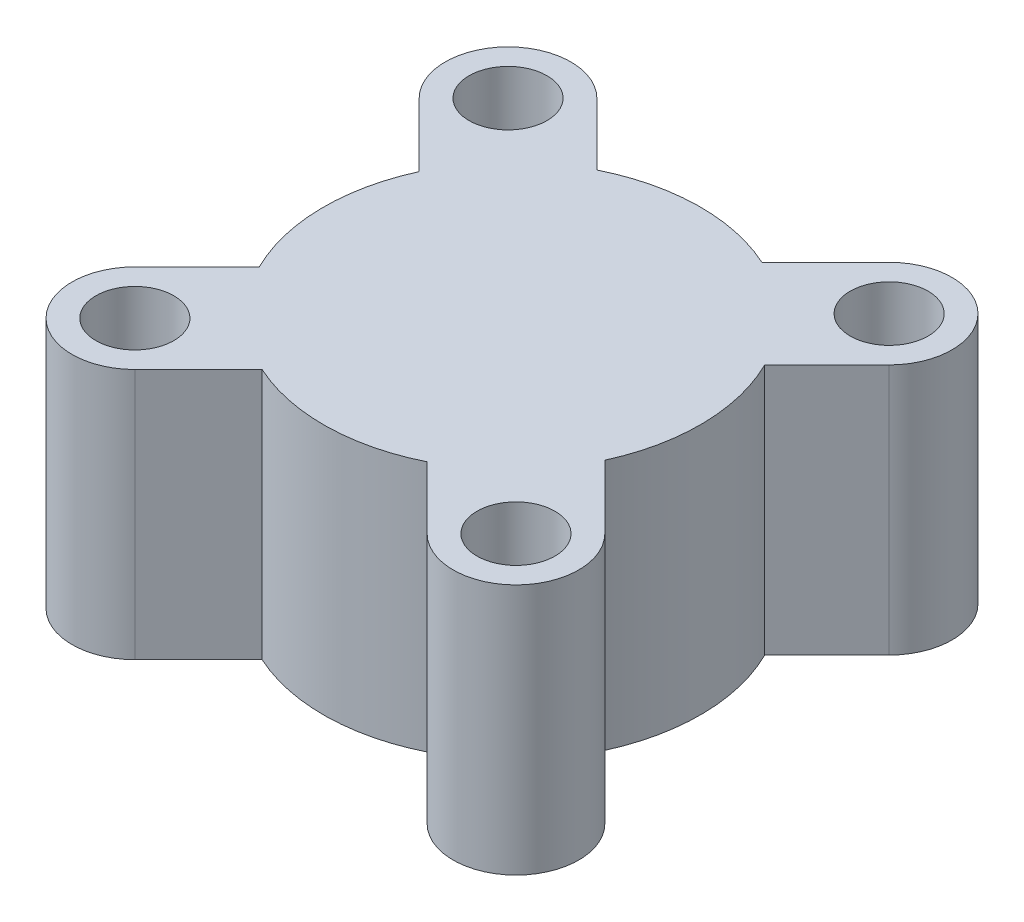
ISO-10303-21;
HEADER;
FILE_DESCRIPTION(('STEP AP214'),'2;1');
FILE_NAME('part.step','',(''),(''),'','','');
FILE_SCHEMA(('AUTOMOTIVE_DESIGN { 1 0 10303 214 1 1 1 1 }'));
ENDSEC;
DATA;
#1=APPLICATION_CONTEXT('core data for automotive mechanical design processes');
#2=APPLICATION_PROTOCOL_DEFINITION('international standard','automotive_design',2000,#1);
#3=PRODUCT_CONTEXT('',#1,'mechanical');
#4=PRODUCT('Part','Part','',(#3));
#5=PRODUCT_RELATED_PRODUCT_CATEGORY('part','',(#4));
#6=PRODUCT_DEFINITION_FORMATION('','',#4);
#7=PRODUCT_DEFINITION_CONTEXT('part definition',#1,'design');
#8=PRODUCT_DEFINITION('design','',#6,#7);
#9=PRODUCT_DEFINITION_SHAPE('','',#8);
#10=(LENGTH_UNIT() NAMED_UNIT(*) SI_UNIT(.MILLI.,.METRE.));
#11=(NAMED_UNIT(*) PLANE_ANGLE_UNIT() SI_UNIT($,.RADIAN.));
#12=(NAMED_UNIT(*) SI_UNIT($,.STERADIAN.) SOLID_ANGLE_UNIT());
#13=UNCERTAINTY_MEASURE_WITH_UNIT(LENGTH_MEASURE(1.E-05),#10,'distance_accuracy_value','');
#14=(GEOMETRIC_REPRESENTATION_CONTEXT(3) GLOBAL_UNCERTAINTY_ASSIGNED_CONTEXT((#13)) GLOBAL_UNIT_ASSIGNED_CONTEXT((#10,
#11,#12)) REPRESENTATION_CONTEXT('',''));
#15=CARTESIAN_POINT('',(0.,0.,0.));
#16=DIRECTION('',(0.,0.,1.));
#17=DIRECTION('',(1.,0.,0.));
#18=AXIS2_PLACEMENT_3D('',#15,#16,#17);
#19=CARTESIAN_POINT('',(0.,10.,0.));
#20=DIRECTION('',(0.,-1.,0.));
#21=DIRECTION('',(0.,0.,-1.));
#22=AXIS2_PLACEMENT_3D('',#19,#20,#21);
#23=CYLINDRICAL_SURFACE('',#22,7.5);
#24=CARTESIAN_POINT('',(0.,10.,0.));
#25=DIRECTION('',(0.,1.,0.));
#26=DIRECTION('',(0.,0.,1.));
#27=AXIS2_PLACEMENT_3D('',#24,#25,#26);
#28=CIRCLE('',#27,7.5);
#29=CARTESIAN_POINT('',(-6.81877033646609,10.,-3.12319885670608));
#30=VERTEX_POINT('',#29);
#31=CARTESIAN_POINT('',(-6.71533963777482,10.,3.33979244105533));
#32=VERTEX_POINT('',#31);
#33=EDGE_CURVE('E46',#30,#32,#28,.T.);
#34=ORIENTED_EDGE('',*,*,#33,.F.);
#35=DIRECTION('',(0.,-1.,0.));
#36=VECTOR('',#35,1.);
#37=CARTESIAN_POINT('',(-6.81877033646609,10.,-3.12319885670608));
#38=LINE('',#37,#36);
#39=CARTESIAN_POINT('',(-6.81877033646609,0.,-3.12319885670608));
#40=VERTEX_POINT('',#39);
#41=EDGE_CURVE('E190',#30,#40,#38,.T.);
#42=ORIENTED_EDGE('',*,*,#41,.T.);
#43=CARTESIAN_POINT('',(0.,0.,0.));
#44=DIRECTION('',(0.,1.,0.));
#45=DIRECTION('',(0.,0.,1.));
#46=AXIS2_PLACEMENT_3D('',#43,#44,#45);
#47=CIRCLE('',#46,7.5);
#48=CARTESIAN_POINT('',(-6.71533963777482,0.,3.33979244105533));
#49=VERTEX_POINT('',#48);
#50=EDGE_CURVE('E287',#40,#49,#47,.T.);
#51=ORIENTED_EDGE('',*,*,#50,.T.);
#52=DIRECTION('',(0.,-1.,0.));
#53=VECTOR('',#52,1.);
#54=CARTESIAN_POINT('',(-6.71533963777482,10.,3.33979244105533));
#55=LINE('',#54,#53);
#56=EDGE_CURVE('E291',#32,#49,#55,.T.);
#57=ORIENTED_EDGE('',*,*,#56,.F.);
#58=EDGE_LOOP('',(#34,#42,#51,#57));
#59=FACE_BOUND('',#58,.T.);
#60=ADVANCED_FACE('F36',(#59),#23,.T.);
#61=CARTESIAN_POINT('',(3.1231988567061,0.,-6.81877033646608));
#62=VERTEX_POINT('',#61);
#63=CARTESIAN_POINT('',(-3.3397924410554,0.,-6.71533963777479));
#64=VERTEX_POINT('',#63);
#65=EDGE_CURVE('E311',#62,#64,#47,.T.);
#66=ORIENTED_EDGE('',*,*,#65,.T.);
#67=DIRECTION('',(0.,-1.,0.));
#68=VECTOR('',#67,1.);
#69=CARTESIAN_POINT('',(-3.3397924410554,10.,-6.71533963777479));
#70=LINE('',#69,#68);
#71=CARTESIAN_POINT('',(-3.3397924410554,10.,-6.71533963777479));
#72=VERTEX_POINT('',#71);
#73=EDGE_CURVE('E60',#72,#64,#70,.T.);
#74=ORIENTED_EDGE('',*,*,#73,.F.);
#75=CARTESIAN_POINT('',(3.1231988567061,10.,-6.81877033646608));
#76=VERTEX_POINT('',#75);
#77=EDGE_CURVE('E171',#76,#72,#28,.T.);
#78=ORIENTED_EDGE('',*,*,#77,.F.);
#79=DIRECTION('',(0.,-1.,0.));
#80=VECTOR('',#79,1.);
#81=CARTESIAN_POINT('',(3.1231988567061,10.,-6.81877033646608));
#82=LINE('',#81,#80);
#83=EDGE_CURVE('E220',#76,#62,#82,.T.);
#84=ORIENTED_EDGE('',*,*,#83,.T.);
#85=EDGE_LOOP('',(#66,#74,#78,#84));
#86=FACE_BOUND('',#85,.T.);
#87=ADVANCED_FACE('F345',(#86),#23,.T.);
#88=CARTESIAN_POINT('',(6.81877033646607,0.,3.12319885670613));
#89=VERTEX_POINT('',#88);
#90=CARTESIAN_POINT('',(6.7153396377748,0.,-3.33979244105537));
#91=VERTEX_POINT('',#90);
#92=EDGE_CURVE('E312',#89,#91,#47,.T.);
#93=ORIENTED_EDGE('',*,*,#92,.T.);
#94=DIRECTION('',(0.,-1.,0.));
#95=VECTOR('',#94,1.);
#96=CARTESIAN_POINT('',(6.7153396377748,10.,-3.33979244105537));
#97=LINE('',#96,#95);
#98=CARTESIAN_POINT('',(6.7153396377748,10.,-3.33979244105537));
#99=VERTEX_POINT('',#98);
#100=EDGE_CURVE('E223',#99,#91,#97,.T.);
#101=ORIENTED_EDGE('',*,*,#100,.F.);
#102=CARTESIAN_POINT('',(6.81877033646607,10.,3.12319885670613));
#103=VERTEX_POINT('',#102);
#104=EDGE_CURVE('E45',#103,#99,#28,.T.);
#105=ORIENTED_EDGE('',*,*,#104,.F.);
#106=DIRECTION('',(0.,-1.,0.));
#107=VECTOR('',#106,1.);
#108=CARTESIAN_POINT('',(6.81877033646607,10.,3.12319885670613));
#109=LINE('',#108,#107);
#110=EDGE_CURVE('E254',#103,#89,#109,.T.);
#111=ORIENTED_EDGE('',*,*,#110,.T.);
#112=EDGE_LOOP('',(#93,#101,#105,#111));
#113=FACE_BOUND('',#112,.T.);
#114=ADVANCED_FACE('F315',(#113),#23,.T.);
#115=CARTESIAN_POINT('',(-3.12319885670615,0.,6.81877033646605));
#116=VERTEX_POINT('',#115);
#117=CARTESIAN_POINT('',(3.33979244105535,0.,6.71533963777481));
#118=VERTEX_POINT('',#117);
#119=EDGE_CURVE('E40',#116,#118,#47,.T.);
#120=ORIENTED_EDGE('',*,*,#119,.T.);
#121=DIRECTION('',(0.,-1.,0.));
#122=VECTOR('',#121,1.);
#123=CARTESIAN_POINT('',(3.33979244105535,10.,6.71533963777481));
#124=LINE('',#123,#122);
#125=CARTESIAN_POINT('',(3.33979244105535,10.,6.71533963777481));
#126=VERTEX_POINT('',#125);
#127=EDGE_CURVE('E257',#126,#118,#124,.T.);
#128=ORIENTED_EDGE('',*,*,#127,.F.);
#129=CARTESIAN_POINT('',(-3.12319885670615,10.,6.81877033646605));
#130=VERTEX_POINT('',#129);
#131=EDGE_CURVE('E11',#130,#126,#28,.T.);
#132=ORIENTED_EDGE('',*,*,#131,.F.);
#133=DIRECTION('',(0.,-1.,0.));
#134=VECTOR('',#133,1.);
#135=CARTESIAN_POINT('',(-3.12319885670615,10.,6.81877033646605));
#136=LINE('',#135,#134);
#137=EDGE_CURVE('E288',#130,#116,#136,.T.);
#138=ORIENTED_EDGE('',*,*,#137,.T.);
#139=EDGE_LOOP('',(#120,#128,#132,#138));
#140=FACE_BOUND('',#139,.T.);
#141=ADVANCED_FACE('F38',(#140),#23,.T.);
#142=CARTESIAN_POINT('',(0.,10.,0.));
#143=DIRECTION('',(0.,1.,0.));
#144=DIRECTION('',(0.,0.,1.));
#145=AXIS2_PLACEMENT_3D('',#142,#143,#144);
#146=PLANE('',#145);
#147=ORIENTED_EDGE('',*,*,#131,.T.);
#148=DIRECTION('',(-0.706793222581446,0.,-0.707420200809204));
#149=VECTOR('',#148,1.);
#150=CARTESIAN_POINT('',(5.81370838683992,10.,9.19145013125135));
#151=LINE('',#150,#149);
#152=CARTESIAN_POINT('',(5.81370838683992,10.,9.19145013125135));
#153=VERTEX_POINT('',#152);
#154=EDGE_CURVE('E236',#153,#126,#151,.T.);
#155=ORIENTED_EDGE('',*,*,#154,.F.);
#156=CARTESIAN_POINT('',(7.58225888886293,10.,7.42446707479773));
#157=DIRECTION('',(0.,-1.,0.));
#158=DIRECTION('',(0.,0.,-1.));
#159=AXIS2_PLACEMENT_3D('',#156,#157,#158);
#160=CIRCLE('',#159,2.5);
#161=CARTESIAN_POINT('',(9.35080939088594,10.,5.65748401834412));
#162=VERTEX_POINT('',#161);
#163=EDGE_CURVE('E233',#162,#153,#160,.T.);
#164=ORIENTED_EDGE('',*,*,#163,.F.);
#165=DIRECTION('',(0.706793222581445,0.,0.707420200809205));
#166=VECTOR('',#165,1.);
#167=CARTESIAN_POINT('',(9.35080939088594,10.,5.65748401834412));
#168=LINE('',#167,#166);
#169=EDGE_CURVE('E240',#103,#162,#168,.T.);
#170=ORIENTED_EDGE('',*,*,#169,.F.);
#171=ORIENTED_EDGE('',*,*,#104,.T.);
#172=DIRECTION('',(-0.707420200809202,0.,0.706793222581448));
#173=VECTOR('',#172,1.);
#174=CARTESIAN_POINT('',(9.19145013125132,10.,-5.81370838683995));
#175=LINE('',#174,#173);
#176=CARTESIAN_POINT('',(9.19145013125132,10.,-5.81370838683995));
#177=VERTEX_POINT('',#176);
#178=EDGE_CURVE('E202',#177,#99,#175,.T.);
#179=ORIENTED_EDGE('',*,*,#178,.F.);
#180=CARTESIAN_POINT('',(7.4244670747977,10.,-7.58225888886295));
#181=DIRECTION('',(0.,-1.,0.));
#182=DIRECTION('',(0.,0.,-1.));
#183=AXIS2_PLACEMENT_3D('',#180,#181,#182);
#184=CIRCLE('',#183,2.5);
#185=CARTESIAN_POINT('',(5.65748401834408,10.,-9.35080939088596));
#186=VERTEX_POINT('',#185);
#187=EDGE_CURVE('E199',#186,#177,#184,.T.);
#188=ORIENTED_EDGE('',*,*,#187,.F.);
#189=DIRECTION('',(0.707420200809202,0.,-0.706793222581448));
#190=VECTOR('',#189,1.);
#191=CARTESIAN_POINT('',(5.65748401834408,10.,-9.35080939088596));
#192=LINE('',#191,#190);
#193=EDGE_CURVE('E206',#76,#186,#192,.T.);
#194=ORIENTED_EDGE('',*,*,#193,.F.);
#195=ORIENTED_EDGE('',*,*,#77,.T.);
#196=DIRECTION('',(0.70679322258145,0.,0.707420200809199));
#197=VECTOR('',#196,1.);
#198=CARTESIAN_POINT('',(-5.81370838683998,10.,-9.1914501312513));
#199=LINE('',#198,#197);
#200=CARTESIAN_POINT('',(-5.81370838683998,10.,-9.1914501312513));
#201=VERTEX_POINT('',#200);
#202=EDGE_CURVE('E154',#201,#72,#199,.T.);
#203=ORIENTED_EDGE('',*,*,#202,.F.);
#204=CARTESIAN_POINT('',(-7.58225888886298,10.,-7.42446707479768));
#205=DIRECTION('',(0.,-1.,0.));
#206=DIRECTION('',(0.,0.,-1.));
#207=AXIS2_PLACEMENT_3D('',#204,#205,#206);
#208=CIRCLE('',#207,2.5);
#209=CARTESIAN_POINT('',(-9.35080939088598,10.,-5.65748401834405));
#210=VERTEX_POINT('',#209);
#211=EDGE_CURVE('E168',#210,#201,#208,.T.);
#212=ORIENTED_EDGE('',*,*,#211,.F.);
#213=DIRECTION('',(-0.70679322258145,0.,-0.7074202008092));
#214=VECTOR('',#213,1.);
#215=CARTESIAN_POINT('',(-9.35080939088598,10.,-5.65748401834405));
#216=LINE('',#215,#214);
#217=EDGE_CURVE('E161',#30,#210,#216,.T.);
#218=ORIENTED_EDGE('',*,*,#217,.F.);
#219=ORIENTED_EDGE('',*,*,#33,.T.);
#220=DIRECTION('',(0.707420200809207,0.,-0.706793222581443));
#221=VECTOR('',#220,1.);
#222=CARTESIAN_POINT('',(-9.19145013125137,10.,5.81370838683988));
#223=LINE('',#222,#221);
#224=CARTESIAN_POINT('',(-9.19145013125137,10.,5.81370838683988));
#225=VERTEX_POINT('',#224);
#226=EDGE_CURVE('E270',#225,#32,#223,.T.);
#227=ORIENTED_EDGE('',*,*,#226,.F.);
#228=CARTESIAN_POINT('',(-7.42446707479776,10.,7.5822588888629));
#229=DIRECTION('',(0.,-1.,0.));
#230=DIRECTION('',(0.,0.,-1.));
#231=AXIS2_PLACEMENT_3D('',#228,#229,#230);
#232=CIRCLE('',#231,2.5);
#233=CARTESIAN_POINT('',(-5.65748401834415,10.,9.35080939088592));
#234=VERTEX_POINT('',#233);
#235=EDGE_CURVE('E267',#234,#225,#232,.T.);
#236=ORIENTED_EDGE('',*,*,#235,.F.);
#237=DIRECTION('',(-0.707420200809207,0.,0.706793222581443));
#238=VECTOR('',#237,1.);
#239=CARTESIAN_POINT('',(-5.65748401834415,10.,9.35080939088592));
#240=LINE('',#239,#238);
#241=EDGE_CURVE('E274',#130,#234,#240,.T.);
#242=ORIENTED_EDGE('',*,*,#241,.F.);
#243=EDGE_LOOP('',(#147,#155,#164,#170,#171,#179,#188,#194,#195,#203,#212,#218,#219,#227,#236,#242));
#244=FACE_BOUND('',#243,.T.);
#245=CARTESIAN_POINT('',(-7.42446707479776,10.,7.5822588888629));
#246=DIRECTION('',(0.,-1.,0.));
#247=DIRECTION('',(0.,0.,-1.));
#248=AXIS2_PLACEMENT_3D('',#245,#246,#247);
#249=CIRCLE('',#248,1.55);
#250=CARTESIAN_POINT('',(-7.42446707479776,10.,6.0322588888629));
#251=VERTEX_POINT('',#250);
#252=EDGE_CURVE('E261',#251,#251,#249,.T.);
#253=ORIENTED_EDGE('',*,*,#252,.T.);
#254=EDGE_LOOP('',(#253));
#255=FACE_BOUND('',#254,.T.);
#256=CARTESIAN_POINT('',(7.58225888886293,10.,7.42446707479773));
#257=DIRECTION('',(0.,-1.,0.));
#258=DIRECTION('',(0.,0.,-1.));
#259=AXIS2_PLACEMENT_3D('',#256,#257,#258);
#260=CIRCLE('',#259,1.55);
#261=CARTESIAN_POINT('',(7.58225888886293,10.,5.87446707479773));
#262=VERTEX_POINT('',#261);
#263=EDGE_CURVE('E227',#262,#262,#260,.T.);
#264=ORIENTED_EDGE('',*,*,#263,.T.);
#265=EDGE_LOOP('',(#264));
#266=FACE_BOUND('',#265,.T.);
#267=CARTESIAN_POINT('',(7.4244670747977,10.,-7.58225888886295));
#268=DIRECTION('',(0.,-1.,0.));
#269=DIRECTION('',(0.,0.,-1.));
#270=AXIS2_PLACEMENT_3D('',#267,#268,#269);
#271=CIRCLE('',#270,1.55);
#272=CARTESIAN_POINT('',(7.4244670747977,10.,-9.13225888886296));
#273=VERTEX_POINT('',#272);
#274=EDGE_CURVE('E193',#273,#273,#271,.T.);
#275=ORIENTED_EDGE('',*,*,#274,.T.);
#276=EDGE_LOOP('',(#275));
#277=FACE_BOUND('',#276,.T.);
#278=CARTESIAN_POINT('',(-7.58225888886298,10.,-7.42446707479768));
#279=DIRECTION('',(0.,-1.,0.));
#280=DIRECTION('',(0.,0.,-1.));
#281=AXIS2_PLACEMENT_3D('',#278,#279,#280);
#282=CIRCLE('',#281,1.55);
#283=CARTESIAN_POINT('',(-7.58225888886298,10.,-8.97446707479768));
#284=VERTEX_POINT('',#283);
#285=EDGE_CURVE('E186',#284,#284,#282,.T.);
#286=ORIENTED_EDGE('',*,*,#285,.T.);
#287=EDGE_LOOP('',(#286));
#288=FACE_BOUND('',#287,.T.);
#289=ADVANCED_FACE('F165',(#244,#255,#266,#277,#288),#146,.T.);
#290=CARTESIAN_POINT('',(0.,0.,0.));
#291=DIRECTION('',(0.,1.,0.));
#292=DIRECTION('',(0.,0.,1.));
#293=AXIS2_PLACEMENT_3D('',#290,#291,#292);
#294=PLANE('',#293);
#295=CARTESIAN_POINT('',(0.,0.,0.));
#296=DIRECTION('',(0.,-1.,0.));
#297=DIRECTION('',(0.,0.,-1.));
#298=AXIS2_PLACEMENT_3D('',#295,#296,#297);
#299=CIRCLE('',#298,6.05);
#300=CARTESIAN_POINT('',(0.,0.,-6.05));
#301=VERTEX_POINT('',#300);
#302=EDGE_CURVE('E404',#301,#301,#299,.T.);
#303=ORIENTED_EDGE('',*,*,#302,.F.);
#304=EDGE_LOOP('',(#303));
#305=FACE_BOUND('',#304,.T.);
#306=ORIENTED_EDGE('',*,*,#119,.F.);
#307=DIRECTION('',(-0.707420200809207,0.,0.706793222581443));
#308=VECTOR('',#307,1.);
#309=CARTESIAN_POINT('',(-5.65748401834415,0.,9.35080939088592));
#310=LINE('',#309,#308);
#311=CARTESIAN_POINT('',(-5.65748401834415,0.,9.35080939088592));
#312=VERTEX_POINT('',#311);
#313=EDGE_CURVE('E271',#116,#312,#310,.T.);
#314=ORIENTED_EDGE('',*,*,#313,.T.);
#315=CARTESIAN_POINT('',(-7.42446707479776,0.,7.5822588888629));
#316=DIRECTION('',(0.,-1.,0.));
#317=DIRECTION('',(0.,0.,-1.));
#318=AXIS2_PLACEMENT_3D('',#315,#316,#317);
#319=CIRCLE('',#318,2.5);
#320=CARTESIAN_POINT('',(-9.19145013125137,0.,5.81370838683988));
#321=VERTEX_POINT('',#320);
#322=EDGE_CURVE('E264',#312,#321,#319,.T.);
#323=ORIENTED_EDGE('',*,*,#322,.T.);
#324=DIRECTION('',(0.707420200809207,0.,-0.706793222581443));
#325=VECTOR('',#324,1.);
#326=CARTESIAN_POINT('',(-9.19145013125137,0.,5.81370838683988));
#327=LINE('',#326,#325);
#328=EDGE_CURVE('E280',#321,#49,#327,.T.);
#329=ORIENTED_EDGE('',*,*,#328,.T.);
#330=ORIENTED_EDGE('',*,*,#50,.F.);
#331=DIRECTION('',(-0.70679322258145,0.,-0.7074202008092));
#332=VECTOR('',#331,1.);
#333=CARTESIAN_POINT('',(-9.35080939088598,0.,-5.65748401834405));
#334=LINE('',#333,#332);
#335=CARTESIAN_POINT('',(-9.35080939088598,0.,-5.65748401834405));
#336=VERTEX_POINT('',#335);
#337=EDGE_CURVE('E175',#40,#336,#334,.T.);
#338=ORIENTED_EDGE('',*,*,#337,.T.);
#339=CARTESIAN_POINT('',(-7.58225888886298,0.,-7.42446707479768));
#340=DIRECTION('',(0.,-1.,0.));
#341=DIRECTION('',(0.,0.,-1.));
#342=AXIS2_PLACEMENT_3D('',#339,#340,#341);
#343=CIRCLE('',#342,2.5);
#344=CARTESIAN_POINT('',(-5.81370838683998,0.,-9.1914501312513));
#345=VERTEX_POINT('',#344);
#346=EDGE_CURVE('E184',#336,#345,#343,.T.);
#347=ORIENTED_EDGE('',*,*,#346,.T.);
#348=DIRECTION('',(0.70679322258145,0.,0.707420200809199));
#349=VECTOR('',#348,1.);
#350=CARTESIAN_POINT('',(-5.81370838683998,0.,-9.1914501312513));
#351=LINE('',#350,#349);
#352=EDGE_CURVE('E156',#345,#64,#351,.T.);
#353=ORIENTED_EDGE('',*,*,#352,.T.);
#354=ORIENTED_EDGE('',*,*,#65,.F.);
#355=DIRECTION('',(0.707420200809202,0.,-0.706793222581448));
#356=VECTOR('',#355,1.);
#357=CARTESIAN_POINT('',(5.65748401834408,0.,-9.35080939088596));
#358=LINE('',#357,#356);
#359=CARTESIAN_POINT('',(5.65748401834408,0.,-9.35080939088596));
#360=VERTEX_POINT('',#359);
#361=EDGE_CURVE('E203',#62,#360,#358,.T.);
#362=ORIENTED_EDGE('',*,*,#361,.T.);
#363=CARTESIAN_POINT('',(7.4244670747977,0.,-7.58225888886295));
#364=DIRECTION('',(0.,-1.,0.));
#365=DIRECTION('',(0.,0.,-1.));
#366=AXIS2_PLACEMENT_3D('',#363,#364,#365);
#367=CIRCLE('',#366,2.5);
#368=CARTESIAN_POINT('',(9.19145013125132,0.,-5.81370838683995));
#369=VERTEX_POINT('',#368);
#370=EDGE_CURVE('E196',#360,#369,#367,.T.);
#371=ORIENTED_EDGE('',*,*,#370,.T.);
#372=DIRECTION('',(-0.707420200809202,0.,0.706793222581448));
#373=VECTOR('',#372,1.);
#374=CARTESIAN_POINT('',(9.19145013125132,0.,-5.81370838683995));
#375=LINE('',#374,#373);
#376=EDGE_CURVE('E212',#369,#91,#375,.T.);
#377=ORIENTED_EDGE('',*,*,#376,.T.);
#378=ORIENTED_EDGE('',*,*,#92,.F.);
#379=DIRECTION('',(0.706793222581445,0.,0.707420200809205));
#380=VECTOR('',#379,1.);
#381=CARTESIAN_POINT('',(9.35080939088594,0.,5.65748401834412));
#382=LINE('',#381,#380);
#383=CARTESIAN_POINT('',(9.35080939088594,0.,5.65748401834412));
#384=VERTEX_POINT('',#383);
#385=EDGE_CURVE('E237',#89,#384,#382,.T.);
#386=ORIENTED_EDGE('',*,*,#385,.T.);
#387=CARTESIAN_POINT('',(7.58225888886293,0.,7.42446707479773));
#388=DIRECTION('',(0.,-1.,0.));
#389=DIRECTION('',(0.,0.,-1.));
#390=AXIS2_PLACEMENT_3D('',#387,#388,#389);
#391=CIRCLE('',#390,2.5);
#392=CARTESIAN_POINT('',(5.81370838683992,0.,9.19145013125135));
#393=VERTEX_POINT('',#392);
#394=EDGE_CURVE('E230',#384,#393,#391,.T.);
#395=ORIENTED_EDGE('',*,*,#394,.T.);
#396=DIRECTION('',(-0.706793222581446,0.,-0.707420200809204));
#397=VECTOR('',#396,1.);
#398=CARTESIAN_POINT('',(5.81370838683992,0.,9.19145013125135));
#399=LINE('',#398,#397);
#400=EDGE_CURVE('E246',#393,#118,#399,.T.);
#401=ORIENTED_EDGE('',*,*,#400,.T.);
#402=EDGE_LOOP('',(#306,#314,#323,#329,#330,#338,#347,#353,#354,#362,#371,#377,#378,#386,#395,#401));
#403=FACE_BOUND('',#402,.T.);
#404=CARTESIAN_POINT('',(-7.42446707479776,0.,7.5822588888629));
#405=DIRECTION('',(0.,-1.,0.));
#406=DIRECTION('',(0.,0.,-1.));
#407=AXIS2_PLACEMENT_3D('',#404,#405,#406);
#408=CIRCLE('',#407,1.55);
#409=CARTESIAN_POINT('',(-7.42446707479776,0.,6.0322588888629));
#410=VERTEX_POINT('',#409);
#411=EDGE_CURVE('E253',#410,#410,#408,.T.);
#412=ORIENTED_EDGE('',*,*,#411,.F.);
#413=EDGE_LOOP('',(#412));
#414=FACE_BOUND('',#413,.T.);
#415=CARTESIAN_POINT('',(7.58225888886293,0.,7.42446707479773));
#416=DIRECTION('',(0.,-1.,0.));
#417=DIRECTION('',(0.,0.,-1.));
#418=AXIS2_PLACEMENT_3D('',#415,#416,#417);
#419=CIRCLE('',#418,1.55);
#420=CARTESIAN_POINT('',(7.58225888886293,0.,5.87446707479773));
#421=VERTEX_POINT('',#420);
#422=EDGE_CURVE('E219',#421,#421,#419,.T.);
#423=ORIENTED_EDGE('',*,*,#422,.F.);
#424=EDGE_LOOP('',(#423));
#425=FACE_BOUND('',#424,.T.);
#426=CARTESIAN_POINT('',(7.4244670747977,0.,-7.58225888886295));
#427=DIRECTION('',(0.,-1.,0.));
#428=DIRECTION('',(0.,0.,-1.));
#429=AXIS2_PLACEMENT_3D('',#426,#427,#428);
#430=CIRCLE('',#429,1.55);
#431=CARTESIAN_POINT('',(7.4244670747977,0.,-9.13225888886296));
#432=VERTEX_POINT('',#431);
#433=EDGE_CURVE('E189',#432,#432,#430,.T.);
#434=ORIENTED_EDGE('',*,*,#433,.F.);
#435=EDGE_LOOP('',(#434));
#436=FACE_BOUND('',#435,.T.);
#437=CARTESIAN_POINT('',(-7.58225888886298,0.,-7.42446707479768));
#438=DIRECTION('',(0.,-1.,0.));
#439=DIRECTION('',(0.,0.,-1.));
#440=AXIS2_PLACEMENT_3D('',#437,#438,#439);
#441=CIRCLE('',#440,1.55);
#442=CARTESIAN_POINT('',(-7.58225888886298,0.,-8.97446707479768));
#443=VERTEX_POINT('',#442);
#444=EDGE_CURVE('E180',#443,#443,#441,.T.);
#445=ORIENTED_EDGE('',*,*,#444,.F.);
#446=EDGE_LOOP('',(#445));
#447=FACE_BOUND('',#446,.T.);
#448=ADVANCED_FACE('F303',(#305,#403,#414,#425,#436,#447),#294,.F.);
#449=CARTESIAN_POINT('',(-7.42446707479776,10.,7.5822588888629));
#450=DIRECTION('',(0.,-1.,0.));
#451=DIRECTION('',(0.,0.,-1.));
#452=AXIS2_PLACEMENT_3D('',#449,#450,#451);
#453=CYLINDRICAL_SURFACE('',#452,2.5);
#454=ORIENTED_EDGE('',*,*,#322,.F.);
#455=DIRECTION('',(0.,-1.,0.));
#456=VECTOR('',#455,1.);
#457=CARTESIAN_POINT('',(-5.65748401834415,10.,9.35080939088592));
#458=LINE('',#457,#456);
#459=EDGE_CURVE('E285',#234,#312,#458,.T.);
#460=ORIENTED_EDGE('',*,*,#459,.F.);
#461=ORIENTED_EDGE('',*,*,#235,.T.);
#462=DIRECTION('',(0.,-1.,0.));
#463=VECTOR('',#462,1.);
#464=CARTESIAN_POINT('',(-9.19145013125137,10.,5.81370838683988));
#465=LINE('',#464,#463);
#466=EDGE_CURVE('E277',#225,#321,#465,.T.);
#467=ORIENTED_EDGE('',*,*,#466,.T.);
#468=EDGE_LOOP('',(#454,#460,#461,#467));
#469=FACE_BOUND('',#468,.T.);
#470=ADVANCED_FACE('F297',(#469),#453,.T.);
#471=CARTESIAN_POINT('',(-5.65748401834415,10.,9.35080939088592));
#472=DIRECTION('',(0.706793222581443,0.,0.707420200809207));
#473=DIRECTION('',(0.707420200809207,0.,-0.706793222581443));
#474=AXIS2_PLACEMENT_3D('',#471,#472,#473);
#475=PLANE('',#474);
#476=ORIENTED_EDGE('',*,*,#313,.F.);
#477=ORIENTED_EDGE('',*,*,#137,.F.);
#478=ORIENTED_EDGE('',*,*,#241,.T.);
#479=ORIENTED_EDGE('',*,*,#459,.T.);
#480=EDGE_LOOP('',(#476,#477,#478,#479));
#481=FACE_BOUND('',#480,.T.);
#482=ADVANCED_FACE('F308',(#481),#475,.T.);
#483=CARTESIAN_POINT('',(-9.19145013125137,10.,5.81370838683988));
#484=DIRECTION('',(-0.706793222581443,0.,-0.707420200809207));
#485=DIRECTION('',(-0.707420200809207,0.,0.706793222581443));
#486=AXIS2_PLACEMENT_3D('',#483,#484,#485);
#487=PLANE('',#486);
#488=ORIENTED_EDGE('',*,*,#328,.F.);
#489=ORIENTED_EDGE('',*,*,#466,.F.);
#490=ORIENTED_EDGE('',*,*,#226,.T.);
#491=ORIENTED_EDGE('',*,*,#56,.T.);
#492=EDGE_LOOP('',(#488,#489,#490,#491));
#493=FACE_BOUND('',#492,.T.);
#494=ADVANCED_FACE('F301',(#493),#487,.T.);
#495=CARTESIAN_POINT('',(-7.42446707479776,10.,7.5822588888629));
#496=DIRECTION('',(0.,-1.,0.));
#497=DIRECTION('',(0.,0.,-1.));
#498=AXIS2_PLACEMENT_3D('',#495,#496,#497);
#499=CYLINDRICAL_SURFACE('',#498,1.55);
#500=ORIENTED_EDGE('',*,*,#252,.F.);
#501=EDGE_LOOP('',(#500));
#502=FACE_BOUND('',#501,.T.);
#503=ORIENTED_EDGE('',*,*,#411,.T.);
#504=EDGE_LOOP('',(#503));
#505=FACE_BOUND('',#504,.T.);
#506=ADVANCED_FACE('F389',(#502,#505),#499,.F.);
#507=CARTESIAN_POINT('',(7.58225888886293,10.,7.42446707479773));
#508=DIRECTION('',(0.,-1.,0.));
#509=DIRECTION('',(0.,0.,-1.));
#510=AXIS2_PLACEMENT_3D('',#507,#508,#509);
#511=CYLINDRICAL_SURFACE('',#510,2.5);
#512=ORIENTED_EDGE('',*,*,#394,.F.);
#513=DIRECTION('',(0.,-1.,0.));
#514=VECTOR('',#513,1.);
#515=CARTESIAN_POINT('',(9.35080939088594,10.,5.65748401834412));
#516=LINE('',#515,#514);
#517=EDGE_CURVE('E251',#162,#384,#516,.T.);
#518=ORIENTED_EDGE('',*,*,#517,.F.);
#519=ORIENTED_EDGE('',*,*,#163,.T.);
#520=DIRECTION('',(0.,-1.,0.));
#521=VECTOR('',#520,1.);
#522=CARTESIAN_POINT('',(5.81370838683992,10.,9.19145013125135));
#523=LINE('',#522,#521);
#524=EDGE_CURVE('E243',#153,#393,#523,.T.);
#525=ORIENTED_EDGE('',*,*,#524,.T.);
#526=EDGE_LOOP('',(#512,#518,#519,#525));
#527=FACE_BOUND('',#526,.T.);
#528=ADVANCED_FACE('F335',(#527),#511,.T.);
#529=CARTESIAN_POINT('',(9.35080939088594,10.,5.65748401834412));
#530=DIRECTION('',(0.707420200809205,0.,-0.706793222581445));
#531=DIRECTION('',(-0.706793222581445,0.,-0.707420200809205));
#532=AXIS2_PLACEMENT_3D('',#529,#530,#531);
#533=PLANE('',#532);
#534=ORIENTED_EDGE('',*,*,#385,.F.);
#535=ORIENTED_EDGE('',*,*,#110,.F.);
#536=ORIENTED_EDGE('',*,*,#169,.T.);
#537=ORIENTED_EDGE('',*,*,#517,.T.);
#538=EDGE_LOOP('',(#534,#535,#536,#537));
#539=FACE_BOUND('',#538,.T.);
#540=ADVANCED_FACE('F331',(#539),#533,.T.);
#541=CARTESIAN_POINT('',(5.81370838683992,10.,9.19145013125135));
#542=DIRECTION('',(-0.707420200809204,0.,0.706793222581446));
#543=DIRECTION('',(0.706793222581446,0.,0.707420200809204));
#544=AXIS2_PLACEMENT_3D('',#541,#542,#543);
#545=PLANE('',#544);
#546=ORIENTED_EDGE('',*,*,#400,.F.);
#547=ORIENTED_EDGE('',*,*,#524,.F.);
#548=ORIENTED_EDGE('',*,*,#154,.T.);
#549=ORIENTED_EDGE('',*,*,#127,.T.);
#550=EDGE_LOOP('',(#546,#547,#548,#549));
#551=FACE_BOUND('',#550,.T.);
#552=ADVANCED_FACE('F338',(#551),#545,.T.);
#553=CARTESIAN_POINT('',(7.58225888886293,10.,7.42446707479773));
#554=DIRECTION('',(0.,-1.,0.));
#555=DIRECTION('',(0.,0.,-1.));
#556=AXIS2_PLACEMENT_3D('',#553,#554,#555);
#557=CYLINDRICAL_SURFACE('',#556,1.55);
#558=ORIENTED_EDGE('',*,*,#263,.F.);
#559=EDGE_LOOP('',(#558));
#560=FACE_BOUND('',#559,.T.);
#561=ORIENTED_EDGE('',*,*,#422,.T.);
#562=EDGE_LOOP('',(#561));
#563=FACE_BOUND('',#562,.T.);
#564=ADVANCED_FACE('F379',(#560,#563),#557,.F.);
#565=CARTESIAN_POINT('',(7.4244670747977,10.,-7.58225888886295));
#566=DIRECTION('',(0.,-1.,0.));
#567=DIRECTION('',(0.,0.,-1.));
#568=AXIS2_PLACEMENT_3D('',#565,#566,#567);
#569=CYLINDRICAL_SURFACE('',#568,2.5);
#570=ORIENTED_EDGE('',*,*,#370,.F.);
#571=DIRECTION('',(0.,-1.,0.));
#572=VECTOR('',#571,1.);
#573=CARTESIAN_POINT('',(5.65748401834408,10.,-9.35080939088596));
#574=LINE('',#573,#572);
#575=EDGE_CURVE('E217',#186,#360,#574,.T.);
#576=ORIENTED_EDGE('',*,*,#575,.F.);
#577=ORIENTED_EDGE('',*,*,#187,.T.);
#578=DIRECTION('',(0.,-1.,0.));
#579=VECTOR('',#578,1.);
#580=CARTESIAN_POINT('',(9.19145013125132,10.,-5.81370838683995));
#581=LINE('',#580,#579);
#582=EDGE_CURVE('E209',#177,#369,#581,.T.);
#583=ORIENTED_EDGE('',*,*,#582,.T.);
#584=EDGE_LOOP('',(#570,#576,#577,#583));
#585=FACE_BOUND('',#584,.T.);
#586=ADVANCED_FACE('F326',(#585),#569,.T.);
#587=CARTESIAN_POINT('',(5.65748401834408,10.,-9.35080939088596));
#588=DIRECTION('',(-0.706793222581448,0.,-0.707420200809202));
#589=DIRECTION('',(-0.707420200809202,0.,0.706793222581448));
#590=AXIS2_PLACEMENT_3D('',#587,#588,#589);
#591=PLANE('',#590);
#592=ORIENTED_EDGE('',*,*,#361,.F.);
#593=ORIENTED_EDGE('',*,*,#83,.F.);
#594=ORIENTED_EDGE('',*,*,#193,.T.);
#595=ORIENTED_EDGE('',*,*,#575,.T.);
#596=EDGE_LOOP('',(#592,#593,#594,#595));
#597=FACE_BOUND('',#596,.T.);
#598=ADVANCED_FACE('F371',(#597),#591,.T.);
#599=CARTESIAN_POINT('',(9.19145013125132,10.,-5.81370838683995));
#600=DIRECTION('',(0.706793222581448,0.,0.707420200809202));
#601=DIRECTION('',(0.707420200809202,0.,-0.706793222581448));
#602=AXIS2_PLACEMENT_3D('',#599,#600,#601);
#603=PLANE('',#602);
#604=ORIENTED_EDGE('',*,*,#376,.F.);
#605=ORIENTED_EDGE('',*,*,#582,.F.);
#606=ORIENTED_EDGE('',*,*,#178,.T.);
#607=ORIENTED_EDGE('',*,*,#100,.T.);
#608=EDGE_LOOP('',(#604,#605,#606,#607));
#609=FACE_BOUND('',#608,.T.);
#610=ADVANCED_FACE('F321',(#609),#603,.T.);
#611=CARTESIAN_POINT('',(7.4244670747977,10.,-7.58225888886295));
#612=DIRECTION('',(0.,-1.,0.));
#613=DIRECTION('',(0.,0.,-1.));
#614=AXIS2_PLACEMENT_3D('',#611,#612,#613);
#615=CYLINDRICAL_SURFACE('',#614,1.55);
#616=ORIENTED_EDGE('',*,*,#274,.F.);
#617=EDGE_LOOP('',(#616));
#618=FACE_BOUND('',#617,.T.);
#619=ORIENTED_EDGE('',*,*,#433,.T.);
#620=EDGE_LOOP('',(#619));
#621=FACE_BOUND('',#620,.T.);
#622=ADVANCED_FACE('F363',(#618,#621),#615,.F.);
#623=CARTESIAN_POINT('',(-7.58225888886298,10.,-7.42446707479768));
#624=DIRECTION('',(0.,-1.,0.));
#625=DIRECTION('',(0.,0.,-1.));
#626=AXIS2_PLACEMENT_3D('',#623,#624,#625);
#627=CYLINDRICAL_SURFACE('',#626,2.5);
#628=ORIENTED_EDGE('',*,*,#346,.F.);
#629=DIRECTION('',(0.,-1.,0.));
#630=VECTOR('',#629,1.);
#631=CARTESIAN_POINT('',(-9.35080939088598,10.,-5.65748401834405));
#632=LINE('',#631,#630);
#633=EDGE_CURVE('E174',#210,#336,#632,.T.);
#634=ORIENTED_EDGE('',*,*,#633,.F.);
#635=ORIENTED_EDGE('',*,*,#211,.T.);
#636=DIRECTION('',(0.,-1.,0.));
#637=VECTOR('',#636,1.);
#638=CARTESIAN_POINT('',(-5.81370838683998,10.,-9.1914501312513));
#639=LINE('',#638,#637);
#640=EDGE_CURVE('E151',#201,#345,#639,.T.);
#641=ORIENTED_EDGE('',*,*,#640,.T.);
#642=EDGE_LOOP('',(#628,#634,#635,#641));
#643=FACE_BOUND('',#642,.T.);
#644=ADVANCED_FACE('F173',(#643),#627,.T.);
#645=CARTESIAN_POINT('',(-9.35080939088598,10.,-5.65748401834405));
#646=DIRECTION('',(-0.7074202008092,0.,0.70679322258145));
#647=DIRECTION('',(0.70679322258145,0.,0.7074202008092));
#648=AXIS2_PLACEMENT_3D('',#645,#646,#647);
#649=PLANE('',#648);
#650=ORIENTED_EDGE('',*,*,#337,.F.);
#651=ORIENTED_EDGE('',*,*,#41,.F.);
#652=ORIENTED_EDGE('',*,*,#217,.T.);
#653=ORIENTED_EDGE('',*,*,#633,.T.);
#654=EDGE_LOOP('',(#650,#651,#652,#653));
#655=FACE_BOUND('',#654,.T.);
#656=ADVANCED_FACE('F354',(#655),#649,.T.);
#657=CARTESIAN_POINT('',(-5.81370838683998,10.,-9.1914501312513));
#658=DIRECTION('',(0.707420200809199,0.,-0.70679322258145));
#659=DIRECTION('',(-0.706793222581451,0.,-0.7074202008092));
#660=AXIS2_PLACEMENT_3D('',#657,#658,#659);
#661=PLANE('',#660);
#662=ORIENTED_EDGE('',*,*,#352,.F.);
#663=ORIENTED_EDGE('',*,*,#640,.F.);
#664=ORIENTED_EDGE('',*,*,#202,.T.);
#665=ORIENTED_EDGE('',*,*,#73,.T.);
#666=EDGE_LOOP('',(#662,#663,#664,#665));
#667=FACE_BOUND('',#666,.T.);
#668=ADVANCED_FACE('F153',(#667),#661,.T.);
#669=CARTESIAN_POINT('',(-7.58225888886298,10.,-7.42446707479768));
#670=DIRECTION('',(0.,-1.,0.));
#671=DIRECTION('',(0.,0.,-1.));
#672=AXIS2_PLACEMENT_3D('',#669,#670,#671);
#673=CYLINDRICAL_SURFACE('',#672,1.55);
#674=ORIENTED_EDGE('',*,*,#285,.F.);
#675=EDGE_LOOP('',(#674));
#676=FACE_BOUND('',#675,.T.);
#677=ORIENTED_EDGE('',*,*,#444,.T.);
#678=EDGE_LOOP('',(#677));
#679=FACE_BOUND('',#678,.T.);
#680=ADVANCED_FACE('F361',(#676,#679),#673,.F.);
#681=CARTESIAN_POINT('',(0.,8.,0.));
#682=DIRECTION('',(0.,-1.,0.));
#683=DIRECTION('',(0.,0.,-1.));
#684=AXIS2_PLACEMENT_3D('',#681,#682,#683);
#685=CYLINDRICAL_SURFACE('',#684,6.05);
#686=CARTESIAN_POINT('',(0.,8.,0.));
#687=DIRECTION('',(0.,-1.,0.));
#688=DIRECTION('',(0.,0.,-1.));
#689=AXIS2_PLACEMENT_3D('',#686,#687,#688);
#690=CIRCLE('',#689,6.05);
#691=CARTESIAN_POINT('',(0.,8.,-6.05));
#692=VERTEX_POINT('',#691);
#693=EDGE_CURVE('E406',#692,#692,#690,.T.);
#694=ORIENTED_EDGE('',*,*,#693,.F.);
#695=EDGE_LOOP('',(#694));
#696=FACE_BOUND('',#695,.T.);
#697=ORIENTED_EDGE('',*,*,#302,.T.);
#698=EDGE_LOOP('',(#697));
#699=FACE_BOUND('',#698,.T.);
#700=ADVANCED_FACE('F418',(#696,#699),#685,.F.);
#701=CARTESIAN_POINT('',(0.,8.,0.));
#702=DIRECTION('',(0.,-1.,0.));
#703=DIRECTION('',(0.,0.,-1.));
#704=AXIS2_PLACEMENT_3D('',#701,#702,#703);
#705=PLANE('',#704);
#706=ORIENTED_EDGE('',*,*,#693,.T.);
#707=EDGE_LOOP('',(#706));
#708=FACE_BOUND('',#707,.T.);
#709=ADVANCED_FACE('F423',(#708),#705,.T.);
#710=CLOSED_SHELL('',(#60,#87,#114,#141,#289,#448,#470,#482,#494,#506,#528,#540,#552,#564,#586,
#598,#610,#622,#644,#656,#668,#680,#700,#709));
#711=MANIFOLD_SOLID_BREP('B2',#710);
#712=ADVANCED_BREP_SHAPE_REPRESENTATION('',(#18,#711),#14);
#713=SHAPE_DEFINITION_REPRESENTATION(#9,#712);
ENDSEC;
END-ISO-10303-21;
